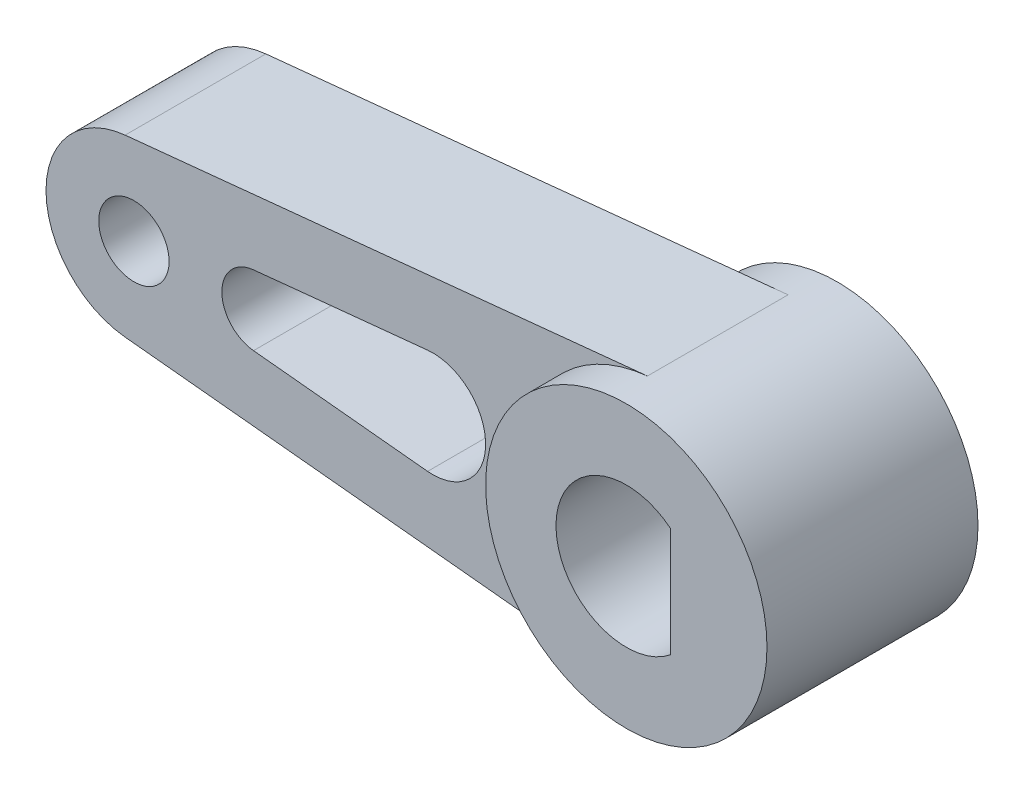
ISO-10303-21;
HEADER;
FILE_DESCRIPTION(('STEP AP214'),'2;1');
FILE_NAME('part.step','',(''),(''),'','','');
FILE_SCHEMA(('AUTOMOTIVE_DESIGN { 1 0 10303 214 1 1 1 1 }'));
ENDSEC;
DATA;
#1=APPLICATION_CONTEXT('core data for automotive mechanical design processes');
#2=APPLICATION_PROTOCOL_DEFINITION('international standard','automotive_design',2000,#1);
#3=PRODUCT_CONTEXT('',#1,'mechanical');
#4=PRODUCT('Part','Part','',(#3));
#5=PRODUCT_RELATED_PRODUCT_CATEGORY('part','',(#4));
#6=PRODUCT_DEFINITION_FORMATION('','',#4);
#7=PRODUCT_DEFINITION_CONTEXT('part definition',#1,'design');
#8=PRODUCT_DEFINITION('design','',#6,#7);
#9=PRODUCT_DEFINITION_SHAPE('','',#8);
#10=(LENGTH_UNIT() NAMED_UNIT(*) SI_UNIT(.MILLI.,.METRE.));
#11=(NAMED_UNIT(*) PLANE_ANGLE_UNIT() SI_UNIT($,.RADIAN.));
#12=(NAMED_UNIT(*) SI_UNIT($,.STERADIAN.) SOLID_ANGLE_UNIT());
#13=UNCERTAINTY_MEASURE_WITH_UNIT(LENGTH_MEASURE(1.E-05),#10,'distance_accuracy_value','');
#14=(GEOMETRIC_REPRESENTATION_CONTEXT(3) GLOBAL_UNCERTAINTY_ASSIGNED_CONTEXT((#13)) GLOBAL_UNIT_ASSIGNED_CONTEXT((#10,
#11,#12)) REPRESENTATION_CONTEXT('',''));
#15=CARTESIAN_POINT('',(0.,0.,0.));
#16=DIRECTION('',(0.,0.,1.));
#17=DIRECTION('',(1.,0.,0.));
#18=AXIS2_PLACEMENT_3D('',#15,#16,#17);
#19=CARTESIAN_POINT('',(-30.,0.,6.));
#20=DIRECTION('',(0.,0.,1.));
#21=DIRECTION('',(1.,0.,0.));
#22=AXIS2_PLACEMENT_3D('',#19,#20,#21);
#23=PLANE('',#22);
#24=DIRECTION('',(0.,1.,0.));
#25=VECTOR('',#24,1.);
#26=CARTESIAN_POINT('',(2.5,3.1224989991992,6.));
#27=LINE('',#26,#25);
#28=CARTESIAN_POINT('',(2.5,-3.1224989991992,6.));
#29=VERTEX_POINT('',#28);
#30=CARTESIAN_POINT('',(2.5,3.1224989991992,6.));
#31=VERTEX_POINT('',#30);
#32=EDGE_CURVE('E148',#29,#31,#27,.T.);
#33=ORIENTED_EDGE('',*,*,#32,.F.);
#34=CARTESIAN_POINT('',(0.,0.,6.));
#35=DIRECTION('',(0.,0.,1.));
#36=DIRECTION('',(1.,0.,0.));
#37=AXIS2_PLACEMENT_3D('',#34,#35,#36);
#38=CIRCLE('',#37,4.);
#39=EDGE_CURVE('E152',#31,#29,#38,.T.);
#40=ORIENTED_EDGE('',*,*,#39,.F.);
#41=EDGE_LOOP('',(#33,#40));
#42=FACE_BOUND('',#41,.T.);
#43=CARTESIAN_POINT('',(0.,0.,6.));
#44=DIRECTION('',(0.,0.,1.));
#45=DIRECTION('',(1.,0.,0.));
#46=AXIS2_PLACEMENT_3D('',#43,#44,#45);
#47=CIRCLE('',#46,7.99999999999999);
#48=CARTESIAN_POINT('',(7.99999999999999,0.,6.));
#49=VERTEX_POINT('',#48);
#50=EDGE_CURVE('E136',#49,#49,#47,.T.);
#51=ORIENTED_EDGE('',*,*,#50,.T.);
#52=EDGE_LOOP('',(#51));
#53=FACE_BOUND('',#52,.T.);
#54=ADVANCED_FACE('F34',(#42,#53),#23,.T.);
#55=CARTESIAN_POINT('',(-30.,0.,6.));
#56=DIRECTION('',(0.,0.,-1.));
#57=DIRECTION('',(-1.,0.,0.));
#58=AXIS2_PLACEMENT_3D('',#55,#56,#57);
#59=CYLINDRICAL_SURFACE('',#58,5.);
#60=CARTESIAN_POINT('',(-30.,0.,4.));
#61=DIRECTION('',(0.,0.,1.));
#62=DIRECTION('',(1.,0.,0.));
#63=AXIS2_PLACEMENT_3D('',#60,#61,#62);
#64=CIRCLE('',#63,5.);
#65=CARTESIAN_POINT('',(-30.5,4.9749371855331,4.));
#66=VERTEX_POINT('',#65);
#67=CARTESIAN_POINT('',(-30.5,-4.97493718553311,4.));
#68=VERTEX_POINT('',#67);
#69=EDGE_CURVE('E108',#66,#68,#64,.T.);
#70=ORIENTED_EDGE('',*,*,#69,.F.);
#71=DIRECTION('',(0.,0.,-1.));
#72=VECTOR('',#71,1.);
#73=CARTESIAN_POINT('',(-30.5,4.9749371855331,6.));
#74=LINE('',#73,#72);
#75=CARTESIAN_POINT('',(-30.5,4.9749371855331,-4.));
#76=VERTEX_POINT('',#75);
#77=EDGE_CURVE('E134',#66,#76,#74,.T.);
#78=ORIENTED_EDGE('',*,*,#77,.T.);
#79=CARTESIAN_POINT('',(-30.,0.,-4.));
#80=DIRECTION('',(0.,0.,1.));
#81=DIRECTION('',(1.,0.,0.));
#82=AXIS2_PLACEMENT_3D('',#79,#80,#81);
#83=CIRCLE('',#82,5.);
#84=CARTESIAN_POINT('',(-30.5,-4.97493718553311,-4.));
#85=VERTEX_POINT('',#84);
#86=EDGE_CURVE('E127',#76,#85,#83,.T.);
#87=ORIENTED_EDGE('',*,*,#86,.T.);
#88=DIRECTION('',(0.,0.,-1.));
#89=VECTOR('',#88,1.);
#90=CARTESIAN_POINT('',(-30.5,-4.97493718553311,6.));
#91=LINE('',#90,#89);
#92=EDGE_CURVE('E121',#68,#85,#91,.T.);
#93=ORIENTED_EDGE('',*,*,#92,.F.);
#94=EDGE_LOOP('',(#70,#78,#87,#93));
#95=FACE_BOUND('',#94,.T.);
#96=ADVANCED_FACE('F36',(#95),#59,.T.);
#97=CARTESIAN_POINT('',(-0.799999999999998,-7.95989949685295,6.));
#98=DIRECTION('',(0.0999999999999996,0.99498743710662,0.));
#99=DIRECTION('',(-0.99498743710662,0.0999999999999997,0.));
#100=AXIS2_PLACEMENT_3D('',#97,#98,#99);
#101=PLANE('',#100);
#102=DIRECTION('',(-0.99498743710662,0.0999999999999996,0.));
#103=VECTOR('',#102,1.);
#104=CARTESIAN_POINT('',(-30.5,-4.97493718553311,4.));
#105=LINE('',#104,#103);
#106=CARTESIAN_POINT('',(-0.799999999999993,-7.95989949685295,4.));
#107=VERTEX_POINT('',#106);
#108=EDGE_CURVE('E111',#107,#68,#105,.T.);
#109=ORIENTED_EDGE('',*,*,#108,.T.);
#110=ORIENTED_EDGE('',*,*,#92,.T.);
#111=DIRECTION('',(0.99498743710662,-0.0999999999999996,0.));
#112=VECTOR('',#111,1.);
#113=CARTESIAN_POINT('',(-30.5,-4.97493718553311,-4.));
#114=LINE('',#113,#112);
#115=CARTESIAN_POINT('',(-0.799999999999993,-7.95989949685295,-4.));
#116=VERTEX_POINT('',#115);
#117=EDGE_CURVE('E186',#85,#116,#114,.T.);
#118=ORIENTED_EDGE('',*,*,#117,.T.);
#119=DIRECTION('',(0.,0.,-1.));
#120=VECTOR('',#119,1.);
#121=CARTESIAN_POINT('',(-0.8,-7.95989949685295,6.));
#122=LINE('',#121,#120);
#123=EDGE_CURVE('E123',#107,#116,#122,.T.);
#124=ORIENTED_EDGE('',*,*,#123,.F.);
#125=EDGE_LOOP('',(#109,#110,#118,#124));
#126=FACE_BOUND('',#125,.T.);
#127=ADVANCED_FACE('F119',(#126),#101,.F.);
#128=CARTESIAN_POINT('',(-30.5,4.9749371855331,6.));
#129=DIRECTION('',(0.0999999999999998,-0.99498743710662,0.));
#130=DIRECTION('',(0.99498743710662,0.0999999999999998,0.));
#131=AXIS2_PLACEMENT_3D('',#128,#129,#130);
#132=PLANE('',#131);
#133=DIRECTION('',(0.99498743710662,0.0999999999999999,0.));
#134=VECTOR('',#133,1.);
#135=CARTESIAN_POINT('',(-30.5,4.9749371855331,4.));
#136=LINE('',#135,#134);
#137=CARTESIAN_POINT('',(-0.8,7.95989949685295,4.));
#138=VERTEX_POINT('',#137);
#139=EDGE_CURVE('E113',#66,#138,#136,.T.);
#140=ORIENTED_EDGE('',*,*,#139,.T.);
#141=DIRECTION('',(0.,0.,-1.));
#142=VECTOR('',#141,1.);
#143=CARTESIAN_POINT('',(-0.8,7.95989949685295,6.));
#144=LINE('',#143,#142);
#145=CARTESIAN_POINT('',(-0.799999999999992,7.95989949685295,-4.));
#146=VERTEX_POINT('',#145);
#147=EDGE_CURVE('E130',#138,#146,#144,.T.);
#148=ORIENTED_EDGE('',*,*,#147,.T.);
#149=DIRECTION('',(-0.99498743710662,-0.0999999999999999,0.));
#150=VECTOR('',#149,1.);
#151=CARTESIAN_POINT('',(-30.5,4.9749371855331,-4.));
#152=LINE('',#151,#150);
#153=EDGE_CURVE('E180',#146,#76,#152,.T.);
#154=ORIENTED_EDGE('',*,*,#153,.T.);
#155=ORIENTED_EDGE('',*,*,#77,.F.);
#156=EDGE_LOOP('',(#140,#148,#154,#155));
#157=FACE_BOUND('',#156,.T.);
#158=ADVANCED_FACE('F206',(#157),#132,.F.);
#159=CARTESIAN_POINT('',(-30.,0.,6.));
#160=DIRECTION('',(0.,0.,-1.));
#161=DIRECTION('',(-1.,0.,0.));
#162=AXIS2_PLACEMENT_3D('',#159,#160,#161);
#163=CYLINDRICAL_SURFACE('',#162,2.);
#164=CARTESIAN_POINT('',(-30.,0.,-4.));
#165=DIRECTION('',(0.,0.,1.));
#166=DIRECTION('',(1.,0.,0.));
#167=AXIS2_PLACEMENT_3D('',#164,#165,#166);
#168=CIRCLE('',#167,2.);
#169=CARTESIAN_POINT('',(-28.,0.,-4.));
#170=VERTEX_POINT('',#169);
#171=EDGE_CURVE('E167',#170,#170,#168,.T.);
#172=ORIENTED_EDGE('',*,*,#171,.F.);
#173=EDGE_LOOP('',(#172));
#174=FACE_BOUND('',#173,.T.);
#175=CARTESIAN_POINT('',(-30.,0.,4.));
#176=DIRECTION('',(0.,0.,1.));
#177=DIRECTION('',(1.,0.,0.));
#178=AXIS2_PLACEMENT_3D('',#175,#176,#177);
#179=CIRCLE('',#178,2.);
#180=CARTESIAN_POINT('',(-28.,0.,4.));
#181=VERTEX_POINT('',#180);
#182=EDGE_CURVE('E188',#181,#181,#179,.T.);
#183=ORIENTED_EDGE('',*,*,#182,.T.);
#184=EDGE_LOOP('',(#183));
#185=FACE_BOUND('',#184,.T.);
#186=ADVANCED_FACE('F234',(#174,#185),#163,.F.);
#187=CARTESIAN_POINT('',(-23.,0.,6.));
#188=DIRECTION('',(0.,0.,-1.));
#189=DIRECTION('',(-1.,0.,0.));
#190=AXIS2_PLACEMENT_3D('',#187,#188,#189);
#191=CYLINDRICAL_SURFACE('',#190,2.);
#192=DIRECTION('',(0.,0.,-1.));
#193=VECTOR('',#192,1.);
#194=CARTESIAN_POINT('',(-23.2,1.98997487421324,6.));
#195=LINE('',#194,#193);
#196=CARTESIAN_POINT('',(-23.2,1.98997487421324,4.));
#197=VERTEX_POINT('',#196);
#198=CARTESIAN_POINT('',(-23.2,1.98997487421324,-4.));
#199=VERTEX_POINT('',#198);
#200=EDGE_CURVE('E165',#197,#199,#195,.T.);
#201=ORIENTED_EDGE('',*,*,#200,.F.);
#202=CARTESIAN_POINT('',(-23.,0.,4.));
#203=DIRECTION('',(0.,0.,1.));
#204=DIRECTION('',(1.,0.,0.));
#205=AXIS2_PLACEMENT_3D('',#202,#203,#204);
#206=CIRCLE('',#205,2.);
#207=CARTESIAN_POINT('',(-23.2,-1.98997487421324,4.));
#208=VERTEX_POINT('',#207);
#209=EDGE_CURVE('E57',#197,#208,#206,.T.);
#210=ORIENTED_EDGE('',*,*,#209,.T.);
#211=DIRECTION('',(0.,0.,-1.));
#212=VECTOR('',#211,1.);
#213=CARTESIAN_POINT('',(-23.2,-1.98997487421324,6.));
#214=LINE('',#213,#212);
#215=CARTESIAN_POINT('',(-23.2,-1.98997487421324,-4.));
#216=VERTEX_POINT('',#215);
#217=EDGE_CURVE('E156',#208,#216,#214,.T.);
#218=ORIENTED_EDGE('',*,*,#217,.T.);
#219=CARTESIAN_POINT('',(-23.,0.,-4.));
#220=DIRECTION('',(0.,0.,1.));
#221=DIRECTION('',(1.,0.,0.));
#222=AXIS2_PLACEMENT_3D('',#219,#220,#221);
#223=CIRCLE('',#222,2.);
#224=EDGE_CURVE('E170',#199,#216,#223,.T.);
#225=ORIENTED_EDGE('',*,*,#224,.F.);
#226=EDGE_LOOP('',(#201,#210,#218,#225));
#227=FACE_BOUND('',#226,.T.);
#228=ADVANCED_FACE('F259',(#227),#191,.F.);
#229=CARTESIAN_POINT('',(-13.3,-2.98496231131986,6.));
#230=DIRECTION('',(0.0999999999999997,0.99498743710662,0.));
#231=DIRECTION('',(-0.99498743710662,0.0999999999999997,0.));
#232=AXIS2_PLACEMENT_3D('',#229,#230,#231);
#233=PLANE('',#232);
#234=ORIENTED_EDGE('',*,*,#217,.F.);
#235=DIRECTION('',(0.99498743710662,-0.0999999999999997,0.));
#236=VECTOR('',#235,1.);
#237=CARTESIAN_POINT('',(-13.3,-2.98496231131986,4.));
#238=LINE('',#237,#236);
#239=CARTESIAN_POINT('',(-13.3,-2.98496231131986,4.));
#240=VERTEX_POINT('',#239);
#241=EDGE_CURVE('E192',#208,#240,#238,.T.);
#242=ORIENTED_EDGE('',*,*,#241,.T.);
#243=DIRECTION('',(0.,0.,-1.));
#244=VECTOR('',#243,1.);
#245=CARTESIAN_POINT('',(-13.3,-2.98496231131986,6.));
#246=LINE('',#245,#244);
#247=CARTESIAN_POINT('',(-13.3,-2.98496231131986,-4.));
#248=VERTEX_POINT('',#247);
#249=EDGE_CURVE('E161',#240,#248,#246,.T.);
#250=ORIENTED_EDGE('',*,*,#249,.T.);
#251=DIRECTION('',(0.99498743710662,-0.0999999999999997,0.));
#252=VECTOR('',#251,1.);
#253=CARTESIAN_POINT('',(-13.3,-2.98496231131986,-4.));
#254=LINE('',#253,#252);
#255=EDGE_CURVE('E173',#216,#248,#254,.T.);
#256=ORIENTED_EDGE('',*,*,#255,.F.);
#257=EDGE_LOOP('',(#234,#242,#250,#256));
#258=FACE_BOUND('',#257,.T.);
#259=ADVANCED_FACE('F266',(#258),#233,.T.);
#260=CARTESIAN_POINT('',(-13.,0.,6.));
#261=DIRECTION('',(0.,0.,-1.));
#262=DIRECTION('',(-1.,0.,0.));
#263=AXIS2_PLACEMENT_3D('',#260,#261,#262);
#264=CYLINDRICAL_SURFACE('',#263,3.);
#265=ORIENTED_EDGE('',*,*,#249,.F.);
#266=CARTESIAN_POINT('',(-13.,0.,4.));
#267=DIRECTION('',(0.,0.,1.));
#268=DIRECTION('',(1.,0.,0.));
#269=AXIS2_PLACEMENT_3D('',#266,#267,#268);
#270=CIRCLE('',#269,3.);
#271=CARTESIAN_POINT('',(-13.3,2.98496231131986,4.));
#272=VERTEX_POINT('',#271);
#273=EDGE_CURVE('E195',#240,#272,#270,.T.);
#274=ORIENTED_EDGE('',*,*,#273,.T.);
#275=DIRECTION('',(0.,0.,-1.));
#276=VECTOR('',#275,1.);
#277=CARTESIAN_POINT('',(-13.3,2.98496231131986,6.));
#278=LINE('',#277,#276);
#279=CARTESIAN_POINT('',(-13.3,2.98496231131986,-4.));
#280=VERTEX_POINT('',#279);
#281=EDGE_CURVE('E163',#272,#280,#278,.T.);
#282=ORIENTED_EDGE('',*,*,#281,.T.);
#283=CARTESIAN_POINT('',(-13.,0.,-4.));
#284=DIRECTION('',(0.,0.,1.));
#285=DIRECTION('',(1.,0.,0.));
#286=AXIS2_PLACEMENT_3D('',#283,#284,#285);
#287=CIRCLE('',#286,3.);
#288=EDGE_CURVE('E176',#248,#280,#287,.T.);
#289=ORIENTED_EDGE('',*,*,#288,.F.);
#290=EDGE_LOOP('',(#265,#274,#282,#289));
#291=FACE_BOUND('',#290,.T.);
#292=ADVANCED_FACE('F274',(#291),#264,.F.);
#293=CARTESIAN_POINT('',(-23.2,1.98997487421324,6.));
#294=DIRECTION('',(0.1,-0.99498743710662,0.));
#295=DIRECTION('',(0.99498743710662,0.1,0.));
#296=AXIS2_PLACEMENT_3D('',#293,#294,#295);
#297=PLANE('',#296);
#298=ORIENTED_EDGE('',*,*,#281,.F.);
#299=DIRECTION('',(-0.99498743710662,-0.1,0.));
#300=VECTOR('',#299,1.);
#301=CARTESIAN_POINT('',(-23.2,1.98997487421324,4.));
#302=LINE('',#301,#300);
#303=EDGE_CURVE('E11',#272,#197,#302,.T.);
#304=ORIENTED_EDGE('',*,*,#303,.T.);
#305=ORIENTED_EDGE('',*,*,#200,.T.);
#306=DIRECTION('',(-0.99498743710662,-0.1,0.));
#307=VECTOR('',#306,1.);
#308=CARTESIAN_POINT('',(-23.2,1.98997487421324,-4.));
#309=LINE('',#308,#307);
#310=EDGE_CURVE('E42',#280,#199,#309,.T.);
#311=ORIENTED_EDGE('',*,*,#310,.F.);
#312=EDGE_LOOP('',(#298,#304,#305,#311));
#313=FACE_BOUND('',#312,.T.);
#314=ADVANCED_FACE('F239',(#313),#297,.T.);
#315=CARTESIAN_POINT('',(-30.,0.,-6.));
#316=DIRECTION('',(0.,0.,1.));
#317=DIRECTION('',(1.,0.,0.));
#318=AXIS2_PLACEMENT_3D('',#315,#316,#317);
#319=PLANE('',#318);
#320=CARTESIAN_POINT('',(0.,0.,-6.));
#321=DIRECTION('',(0.,0.,1.));
#322=DIRECTION('',(1.,0.,0.));
#323=AXIS2_PLACEMENT_3D('',#320,#321,#322);
#324=CIRCLE('',#323,4.);
#325=CARTESIAN_POINT('',(2.5,3.1224989991992,-6.));
#326=VERTEX_POINT('',#325);
#327=CARTESIAN_POINT('',(2.5,-3.1224989991992,-6.));
#328=VERTEX_POINT('',#327);
#329=EDGE_CURVE('E153',#326,#328,#324,.T.);
#330=ORIENTED_EDGE('',*,*,#329,.T.);
#331=DIRECTION('',(0.,1.,0.));
#332=VECTOR('',#331,1.);
#333=CARTESIAN_POINT('',(2.5,3.1224989991992,-6.));
#334=LINE('',#333,#332);
#335=EDGE_CURVE('E149',#328,#326,#334,.T.);
#336=ORIENTED_EDGE('',*,*,#335,.T.);
#337=EDGE_LOOP('',(#330,#336));
#338=FACE_BOUND('',#337,.T.);
#339=CARTESIAN_POINT('',(0.,0.,-6.));
#340=DIRECTION('',(0.,0.,1.));
#341=DIRECTION('',(1.,0.,0.));
#342=AXIS2_PLACEMENT_3D('',#339,#340,#341);
#343=CIRCLE('',#342,7.99999999999999);
#344=CARTESIAN_POINT('',(7.99999999999999,0.,-6.));
#345=VERTEX_POINT('',#344);
#346=EDGE_CURVE('E137',#345,#345,#343,.T.);
#347=ORIENTED_EDGE('',*,*,#346,.F.);
#348=EDGE_LOOP('',(#347));
#349=FACE_BOUND('',#348,.T.);
#350=ADVANCED_FACE('F236',(#338,#349),#319,.F.);
#351=CARTESIAN_POINT('',(0.,0.,6.));
#352=DIRECTION('',(0.,0.,-1.));
#353=DIRECTION('',(-1.,0.,0.));
#354=AXIS2_PLACEMENT_3D('',#351,#352,#353);
#355=CYLINDRICAL_SURFACE('',#354,7.99999999999999);
#356=CARTESIAN_POINT('',(0.,0.,4.));
#357=DIRECTION('',(0.,0.,1.));
#358=DIRECTION('',(1.,0.,0.));
#359=AXIS2_PLACEMENT_3D('',#356,#357,#358);
#360=CIRCLE('',#359,7.99999999999999);
#361=EDGE_CURVE('E49',#138,#107,#360,.T.);
#362=ORIENTED_EDGE('',*,*,#361,.T.);
#363=ORIENTED_EDGE('',*,*,#123,.T.);
#364=CARTESIAN_POINT('',(0.,0.,-4.));
#365=DIRECTION('',(0.,0.,1.));
#366=DIRECTION('',(1.,0.,0.));
#367=AXIS2_PLACEMENT_3D('',#364,#365,#366);
#368=CIRCLE('',#367,7.99999999999999);
#369=EDGE_CURVE('E183',#146,#116,#368,.T.);
#370=ORIENTED_EDGE('',*,*,#369,.F.);
#371=ORIENTED_EDGE('',*,*,#147,.F.);
#372=EDGE_LOOP('',(#362,#363,#370,#371));
#373=FACE_BOUND('',#372,.T.);
#374=ORIENTED_EDGE('',*,*,#346,.T.);
#375=EDGE_LOOP('',(#374));
#376=FACE_BOUND('',#375,.T.);
#377=ORIENTED_EDGE('',*,*,#50,.F.);
#378=EDGE_LOOP('',(#377));
#379=FACE_BOUND('',#378,.T.);
#380=ADVANCED_FACE('F201',(#373,#376,#379),#355,.T.);
#381=CARTESIAN_POINT('',(0.,0.,6.));
#382=DIRECTION('',(0.,0.,-1.));
#383=DIRECTION('',(-1.,0.,0.));
#384=AXIS2_PLACEMENT_3D('',#381,#382,#383);
#385=CYLINDRICAL_SURFACE('',#384,4.);
#386=ORIENTED_EDGE('',*,*,#329,.F.);
#387=DIRECTION('',(0.,0.,-1.));
#388=VECTOR('',#387,1.);
#389=CARTESIAN_POINT('',(2.5,3.1224989991992,6.));
#390=LINE('',#389,#388);
#391=EDGE_CURVE('E145',#31,#326,#390,.T.);
#392=ORIENTED_EDGE('',*,*,#391,.F.);
#393=ORIENTED_EDGE('',*,*,#39,.T.);
#394=DIRECTION('',(0.,0.,-1.));
#395=VECTOR('',#394,1.);
#396=CARTESIAN_POINT('',(2.5,-3.1224989991992,6.));
#397=LINE('',#396,#395);
#398=EDGE_CURVE('E140',#29,#328,#397,.T.);
#399=ORIENTED_EDGE('',*,*,#398,.T.);
#400=EDGE_LOOP('',(#386,#392,#393,#399));
#401=FACE_BOUND('',#400,.T.);
#402=ADVANCED_FACE('F219',(#401),#385,.F.);
#403=CARTESIAN_POINT('',(2.5,3.1224989991992,6.));
#404=DIRECTION('',(-1.,0.,0.));
#405=DIRECTION('',(0.,0.,1.));
#406=AXIS2_PLACEMENT_3D('',#403,#404,#405);
#407=PLANE('',#406);
#408=ORIENTED_EDGE('',*,*,#335,.F.);
#409=ORIENTED_EDGE('',*,*,#398,.F.);
#410=ORIENTED_EDGE('',*,*,#32,.T.);
#411=ORIENTED_EDGE('',*,*,#391,.T.);
#412=EDGE_LOOP('',(#408,#409,#410,#411));
#413=FACE_BOUND('',#412,.T.);
#414=ADVANCED_FACE('F210',(#413),#407,.T.);
#415=CARTESIAN_POINT('',(0.,0.,-4.));
#416=DIRECTION('',(0.,0.,1.));
#417=DIRECTION('',(1.,0.,0.));
#418=AXIS2_PLACEMENT_3D('',#415,#416,#417);
#419=PLANE('',#418);
#420=ORIENTED_EDGE('',*,*,#171,.T.);
#421=EDGE_LOOP('',(#420));
#422=FACE_BOUND('',#421,.T.);
#423=ORIENTED_EDGE('',*,*,#224,.T.);
#424=ORIENTED_EDGE('',*,*,#255,.T.);
#425=ORIENTED_EDGE('',*,*,#288,.T.);
#426=ORIENTED_EDGE('',*,*,#310,.T.);
#427=EDGE_LOOP('',(#423,#424,#425,#426));
#428=FACE_BOUND('',#427,.T.);
#429=ORIENTED_EDGE('',*,*,#117,.F.);
#430=ORIENTED_EDGE('',*,*,#86,.F.);
#431=ORIENTED_EDGE('',*,*,#153,.F.);
#432=ORIENTED_EDGE('',*,*,#369,.T.);
#433=EDGE_LOOP('',(#429,#430,#431,#432));
#434=FACE_BOUND('',#433,.T.);
#435=ADVANCED_FACE('F208',(#422,#428,#434),#419,.F.);
#436=CARTESIAN_POINT('',(-30.,0.,4.));
#437=DIRECTION('',(0.,0.,1.));
#438=DIRECTION('',(1.,0.,0.));
#439=AXIS2_PLACEMENT_3D('',#436,#437,#438);
#440=PLANE('',#439);
#441=ORIENTED_EDGE('',*,*,#182,.F.);
#442=EDGE_LOOP('',(#441));
#443=FACE_BOUND('',#442,.T.);
#444=ORIENTED_EDGE('',*,*,#303,.F.);
#445=ORIENTED_EDGE('',*,*,#273,.F.);
#446=ORIENTED_EDGE('',*,*,#241,.F.);
#447=ORIENTED_EDGE('',*,*,#209,.F.);
#448=EDGE_LOOP('',(#444,#445,#446,#447));
#449=FACE_BOUND('',#448,.T.);
#450=ORIENTED_EDGE('',*,*,#69,.T.);
#451=ORIENTED_EDGE('',*,*,#108,.F.);
#452=ORIENTED_EDGE('',*,*,#361,.F.);
#453=ORIENTED_EDGE('',*,*,#139,.F.);
#454=EDGE_LOOP('',(#450,#451,#452,#453));
#455=FACE_BOUND('',#454,.T.);
#456=ADVANCED_FACE('F110',(#443,#449,#455),#440,.T.);
#457=CLOSED_SHELL('',(#54,#96,#127,#158,#186,#228,#259,#292,#314,#350,#380,#402,#414,#435,#456));
#458=MANIFOLD_SOLID_BREP('B2',#457);
#459=ADVANCED_BREP_SHAPE_REPRESENTATION('',(#18,#458),#14);
#460=SHAPE_DEFINITION_REPRESENTATION(#9,#459);
ENDSEC;
END-ISO-10303-21;
